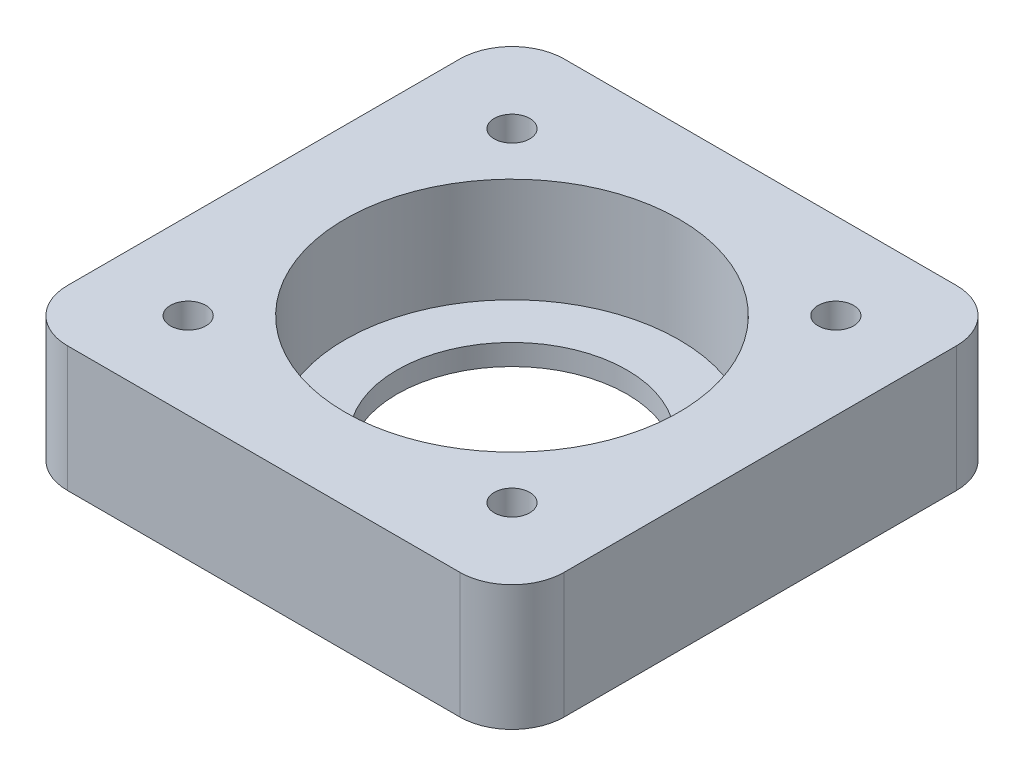
ISO-10303-21;
HEADER;
FILE_DESCRIPTION(('STEP AP214'),'2;1');
FILE_NAME('part.step','',(''),(''),'','','');
FILE_SCHEMA(('AUTOMOTIVE_DESIGN { 1 0 10303 214 1 1 1 1 }'));
ENDSEC;
DATA;
#1=APPLICATION_CONTEXT('core data for automotive mechanical design processes');
#2=APPLICATION_PROTOCOL_DEFINITION('international standard','automotive_design',2000,#1);
#3=PRODUCT_CONTEXT('',#1,'mechanical');
#4=PRODUCT('Part','Part','',(#3));
#5=PRODUCT_RELATED_PRODUCT_CATEGORY('part','',(#4));
#6=PRODUCT_DEFINITION_FORMATION('','',#4);
#7=PRODUCT_DEFINITION_CONTEXT('part definition',#1,'design');
#8=PRODUCT_DEFINITION('design','',#6,#7);
#9=PRODUCT_DEFINITION_SHAPE('','',#8);
#10=(LENGTH_UNIT() NAMED_UNIT(*) SI_UNIT(.MILLI.,.METRE.));
#11=(NAMED_UNIT(*) PLANE_ANGLE_UNIT() SI_UNIT($,.RADIAN.));
#12=(NAMED_UNIT(*) SI_UNIT($,.STERADIAN.) SOLID_ANGLE_UNIT());
#13=UNCERTAINTY_MEASURE_WITH_UNIT(LENGTH_MEASURE(1.E-05),#10,'distance_accuracy_value','');
#14=(GEOMETRIC_REPRESENTATION_CONTEXT(3) GLOBAL_UNCERTAINTY_ASSIGNED_CONTEXT((#13)) GLOBAL_UNIT_ASSIGNED_CONTEXT((#10,
#11,#12)) REPRESENTATION_CONTEXT('',''));
#15=CARTESIAN_POINT('',(0.,0.,0.));
#16=DIRECTION('',(0.,0.,1.));
#17=DIRECTION('',(1.,0.,0.));
#18=AXIS2_PLACEMENT_3D('',#15,#16,#17);
#19=CARTESIAN_POINT('',(1.11022302462516E-13,12.,-2.22044604925031E-13));
#20=DIRECTION('',(0.,-1.,0.));
#21=DIRECTION('',(0.,0.,-1.));
#22=AXIS2_PLACEMENT_3D('',#19,#20,#21);
#23=CYLINDRICAL_SURFACE('',#22,16.);
#24=CARTESIAN_POINT('',(1.11022302462516E-13,12.,-2.22044604925031E-13));
#25=DIRECTION('',(0.,1.,0.));
#26=DIRECTION('',(0.,0.,1.));
#27=AXIS2_PLACEMENT_3D('',#24,#25,#26);
#28=CIRCLE('',#27,16.);
#29=CARTESIAN_POINT('',(1.11022302462516E-13,12.,15.9999999999998));
#30=VERTEX_POINT('',#29);
#31=EDGE_CURVE('E221',#30,#30,#28,.T.);
#32=ORIENTED_EDGE('',*,*,#31,.T.);
#33=EDGE_LOOP('',(#32));
#34=FACE_BOUND('',#33,.T.);
#35=CARTESIAN_POINT('',(1.11022302462516E-13,2.,-2.22044604925031E-13));
#36=DIRECTION('',(0.,-1.,0.));
#37=DIRECTION('',(0.,0.,-1.));
#38=AXIS2_PLACEMENT_3D('',#35,#36,#37);
#39=CIRCLE('',#38,16.);
#40=CARTESIAN_POINT('',(1.11022302462516E-13,2.,-16.0000000000002));
#41=VERTEX_POINT('',#40);
#42=EDGE_CURVE('E201',#41,#41,#39,.F.);
#43=ORIENTED_EDGE('',*,*,#42,.F.);
#44=EDGE_LOOP('',(#43));
#45=FACE_BOUND('',#44,.T.);
#46=ADVANCED_FACE('F47',(#34,#45),#23,.F.);
#47=CARTESIAN_POINT('',(23.775,12.,0.));
#48=DIRECTION('',(1.,0.,0.));
#49=DIRECTION('',(0.,0.,-1.));
#50=AXIS2_PLACEMENT_3D('',#47,#48,#49);
#51=PLANE('',#50);
#52=DIRECTION('',(0.,0.,1.));
#53=VECTOR('',#52,1.);
#54=CARTESIAN_POINT('',(23.775,0.,0.));
#55=LINE('',#54,#53);
#56=CARTESIAN_POINT('',(23.775,0.,-18.775));
#57=VERTEX_POINT('',#56);
#58=CARTESIAN_POINT('',(23.775,0.,18.775));
#59=VERTEX_POINT('',#58);
#60=EDGE_CURVE('E137',#57,#59,#55,.T.);
#61=ORIENTED_EDGE('',*,*,#60,.F.);
#62=DIRECTION('',(0.,-1.,0.));
#63=VECTOR('',#62,1.);
#64=CARTESIAN_POINT('',(23.775,12.,-18.775));
#65=LINE('',#64,#63);
#66=CARTESIAN_POINT('',(23.775,12.,-18.775));
#67=VERTEX_POINT('',#66);
#68=EDGE_CURVE('E165',#57,#67,#65,.F.);
#69=ORIENTED_EDGE('',*,*,#68,.T.);
#70=DIRECTION('',(0.,0.,1.));
#71=VECTOR('',#70,1.);
#72=CARTESIAN_POINT('',(23.775,12.,0.));
#73=LINE('',#72,#71);
#74=CARTESIAN_POINT('',(23.775,12.,18.775));
#75=VERTEX_POINT('',#74);
#76=EDGE_CURVE('E192',#67,#75,#73,.T.);
#77=ORIENTED_EDGE('',*,*,#76,.T.);
#78=DIRECTION('',(0.,-1.,0.));
#79=VECTOR('',#78,1.);
#80=CARTESIAN_POINT('',(23.775,0.,18.775));
#81=LINE('',#80,#79);
#82=EDGE_CURVE('E161',#75,#59,#81,.T.);
#83=ORIENTED_EDGE('',*,*,#82,.T.);
#84=EDGE_LOOP('',(#61,#69,#77,#83));
#85=FACE_BOUND('',#84,.T.);
#86=ADVANCED_FACE('F249',(#85),#51,.T.);
#87=CARTESIAN_POINT('',(0.,12.,-23.775));
#88=DIRECTION('',(0.,0.,-1.));
#89=DIRECTION('',(-1.,0.,0.));
#90=AXIS2_PLACEMENT_3D('',#87,#88,#89);
#91=PLANE('',#90);
#92=DIRECTION('',(1.,0.,0.));
#93=VECTOR('',#92,1.);
#94=CARTESIAN_POINT('',(0.,12.,-23.775));
#95=LINE('',#94,#93);
#96=CARTESIAN_POINT('',(-18.775,12.,-23.775));
#97=VERTEX_POINT('',#96);
#98=CARTESIAN_POINT('',(18.775,12.,-23.775));
#99=VERTEX_POINT('',#98);
#100=EDGE_CURVE('E189',#97,#99,#95,.T.);
#101=ORIENTED_EDGE('',*,*,#100,.T.);
#102=DIRECTION('',(0.,-1.,0.));
#103=VECTOR('',#102,1.);
#104=CARTESIAN_POINT('',(18.775,12.,-23.775));
#105=LINE('',#104,#103);
#106=CARTESIAN_POINT('',(18.775,0.,-23.775));
#107=VERTEX_POINT('',#106);
#108=EDGE_CURVE('E127',#99,#107,#105,.T.);
#109=ORIENTED_EDGE('',*,*,#108,.T.);
#110=DIRECTION('',(1.,0.,0.));
#111=VECTOR('',#110,1.);
#112=CARTESIAN_POINT('',(0.,0.,-23.775));
#113=LINE('',#112,#111);
#114=CARTESIAN_POINT('',(-18.775,0.,-23.775));
#115=VERTEX_POINT('',#114);
#116=EDGE_CURVE('E118',#115,#107,#113,.T.);
#117=ORIENTED_EDGE('',*,*,#116,.F.);
#118=DIRECTION('',(0.,-1.,0.));
#119=VECTOR('',#118,1.);
#120=CARTESIAN_POINT('',(-18.775,12.,-23.775));
#121=LINE('',#120,#119);
#122=EDGE_CURVE('E133',#115,#97,#121,.F.);
#123=ORIENTED_EDGE('',*,*,#122,.T.);
#124=EDGE_LOOP('',(#101,#109,#117,#123));
#125=FACE_BOUND('',#124,.T.);
#126=ADVANCED_FACE('F132',(#125),#91,.T.);
#127=CARTESIAN_POINT('',(-23.775,12.,0.));
#128=DIRECTION('',(1.,0.,0.));
#129=DIRECTION('',(0.,0.,-1.));
#130=AXIS2_PLACEMENT_3D('',#127,#128,#129);
#131=PLANE('',#130);
#132=DIRECTION('',(0.,0.,1.));
#133=VECTOR('',#132,1.);
#134=CARTESIAN_POINT('',(-23.775,0.,0.));
#135=LINE('',#134,#133);
#136=CARTESIAN_POINT('',(-23.775,0.,-18.775));
#137=VERTEX_POINT('',#136);
#138=CARTESIAN_POINT('',(-23.775,0.,18.775));
#139=VERTEX_POINT('',#138);
#140=EDGE_CURVE('E120',#137,#139,#135,.T.);
#141=ORIENTED_EDGE('',*,*,#140,.T.);
#142=DIRECTION('',(0.,-1.,0.));
#143=VECTOR('',#142,1.);
#144=CARTESIAN_POINT('',(-23.775,12.,18.775));
#145=LINE('',#144,#143);
#146=CARTESIAN_POINT('',(-23.775,12.,18.775));
#147=VERTEX_POINT('',#146);
#148=EDGE_CURVE('E11',#139,#147,#145,.F.);
#149=ORIENTED_EDGE('',*,*,#148,.T.);
#150=DIRECTION('',(0.,0.,1.));
#151=VECTOR('',#150,1.);
#152=CARTESIAN_POINT('',(-23.775,12.,0.));
#153=LINE('',#152,#151);
#154=CARTESIAN_POINT('',(-23.775,12.,-18.775));
#155=VERTEX_POINT('',#154);
#156=EDGE_CURVE('E147',#155,#147,#153,.T.);
#157=ORIENTED_EDGE('',*,*,#156,.F.);
#158=DIRECTION('',(0.,-1.,0.));
#159=VECTOR('',#158,1.);
#160=CARTESIAN_POINT('',(-23.775,0.,-18.775));
#161=LINE('',#160,#159);
#162=EDGE_CURVE('E56',#155,#137,#161,.T.);
#163=ORIENTED_EDGE('',*,*,#162,.T.);
#164=EDGE_LOOP('',(#141,#149,#157,#163));
#165=FACE_BOUND('',#164,.T.);
#166=ADVANCED_FACE('F186',(#165),#131,.F.);
#167=CARTESIAN_POINT('',(-15.5,12.,-15.4999999999998));
#168=DIRECTION('',(0.,-1.,0.));
#169=DIRECTION('',(0.,0.,-1.));
#170=AXIS2_PLACEMENT_3D('',#167,#168,#169);
#171=CYLINDRICAL_SURFACE('',#170,1.7);
#172=CARTESIAN_POINT('',(-15.5,12.,-15.4999999999998));
#173=DIRECTION('',(0.,1.,0.));
#174=DIRECTION('',(0.,0.,1.));
#175=AXIS2_PLACEMENT_3D('',#172,#173,#174);
#176=CIRCLE('',#175,1.7);
#177=CARTESIAN_POINT('',(-15.5,12.,-13.7999999999998));
#178=VERTEX_POINT('',#177);
#179=EDGE_CURVE('E240',#178,#178,#176,.T.);
#180=ORIENTED_EDGE('',*,*,#179,.T.);
#181=EDGE_LOOP('',(#180));
#182=FACE_BOUND('',#181,.T.);
#183=CARTESIAN_POINT('',(-15.5,0.,-15.4999999999998));
#184=DIRECTION('',(0.,1.,0.));
#185=DIRECTION('',(0.,0.,1.));
#186=AXIS2_PLACEMENT_3D('',#183,#184,#185);
#187=CIRCLE('',#186,1.7);
#188=CARTESIAN_POINT('',(-15.5,0.,-13.7999999999998));
#189=VERTEX_POINT('',#188);
#190=EDGE_CURVE('E209',#189,#189,#187,.T.);
#191=ORIENTED_EDGE('',*,*,#190,.F.);
#192=EDGE_LOOP('',(#191));
#193=FACE_BOUND('',#192,.T.);
#194=ADVANCED_FACE('F376',(#182,#193),#171,.F.);
#195=CARTESIAN_POINT('',(15.5,12.,-15.4999999999998));
#196=DIRECTION('',(0.,-1.,0.));
#197=DIRECTION('',(0.,0.,-1.));
#198=AXIS2_PLACEMENT_3D('',#195,#196,#197);
#199=CYLINDRICAL_SURFACE('',#198,1.7);
#200=CARTESIAN_POINT('',(15.5,12.,-15.4999999999998));
#201=DIRECTION('',(0.,1.,0.));
#202=DIRECTION('',(0.,0.,1.));
#203=AXIS2_PLACEMENT_3D('',#200,#201,#202);
#204=CIRCLE('',#203,1.7);
#205=CARTESIAN_POINT('',(15.5,12.,-13.7999999999998));
#206=VERTEX_POINT('',#205);
#207=EDGE_CURVE('E236',#206,#206,#204,.T.);
#208=ORIENTED_EDGE('',*,*,#207,.T.);
#209=EDGE_LOOP('',(#208));
#210=FACE_BOUND('',#209,.T.);
#211=CARTESIAN_POINT('',(15.5,0.,-15.4999999999998));
#212=DIRECTION('',(0.,1.,0.));
#213=DIRECTION('',(0.,0.,1.));
#214=AXIS2_PLACEMENT_3D('',#211,#212,#213);
#215=CIRCLE('',#214,1.7);
#216=CARTESIAN_POINT('',(15.5,0.,-13.7999999999998));
#217=VERTEX_POINT('',#216);
#218=EDGE_CURVE('E205',#217,#217,#215,.T.);
#219=ORIENTED_EDGE('',*,*,#218,.F.);
#220=EDGE_LOOP('',(#219));
#221=FACE_BOUND('',#220,.T.);
#222=ADVANCED_FACE('F367',(#210,#221),#199,.F.);
#223=CARTESIAN_POINT('',(-15.5,12.,15.5000000000002));
#224=DIRECTION('',(0.,-1.,0.));
#225=DIRECTION('',(0.,0.,-1.));
#226=AXIS2_PLACEMENT_3D('',#223,#224,#225);
#227=CYLINDRICAL_SURFACE('',#226,1.7);
#228=CARTESIAN_POINT('',(-15.5,12.,15.5000000000002));
#229=DIRECTION('',(0.,1.,0.));
#230=DIRECTION('',(0.,0.,1.));
#231=AXIS2_PLACEMENT_3D('',#228,#229,#230);
#232=CIRCLE('',#231,1.7);
#233=CARTESIAN_POINT('',(-15.5,12.,17.2000000000002));
#234=VERTEX_POINT('',#233);
#235=EDGE_CURVE('E227',#234,#234,#232,.T.);
#236=ORIENTED_EDGE('',*,*,#235,.T.);
#237=EDGE_LOOP('',(#236));
#238=FACE_BOUND('',#237,.T.);
#239=CARTESIAN_POINT('',(-15.5,0.,15.5000000000002));
#240=DIRECTION('',(0.,1.,0.));
#241=DIRECTION('',(0.,0.,1.));
#242=AXIS2_PLACEMENT_3D('',#239,#240,#241);
#243=CIRCLE('',#242,1.7);
#244=CARTESIAN_POINT('',(-15.5,0.,17.2000000000002));
#245=VERTEX_POINT('',#244);
#246=EDGE_CURVE('E200',#245,#245,#243,.T.);
#247=ORIENTED_EDGE('',*,*,#246,.F.);
#248=EDGE_LOOP('',(#247));
#249=FACE_BOUND('',#248,.T.);
#250=ADVANCED_FACE('F283',(#238,#249),#227,.F.);
#251=CARTESIAN_POINT('',(15.5,12.,15.5000000000002));
#252=DIRECTION('',(0.,-1.,0.));
#253=DIRECTION('',(0.,0.,-1.));
#254=AXIS2_PLACEMENT_3D('',#251,#252,#253);
#255=CYLINDRICAL_SURFACE('',#254,1.7);
#256=CARTESIAN_POINT('',(15.5,12.,15.5000000000002));
#257=DIRECTION('',(0.,1.,0.));
#258=DIRECTION('',(0.,0.,1.));
#259=AXIS2_PLACEMENT_3D('',#256,#257,#258);
#260=CIRCLE('',#259,1.7);
#261=CARTESIAN_POINT('',(15.5,12.,17.2000000000002));
#262=VERTEX_POINT('',#261);
#263=EDGE_CURVE('E217',#262,#262,#260,.T.);
#264=ORIENTED_EDGE('',*,*,#263,.T.);
#265=EDGE_LOOP('',(#264));
#266=FACE_BOUND('',#265,.T.);
#267=CARTESIAN_POINT('',(15.5,0.,15.5000000000002));
#268=DIRECTION('',(0.,1.,0.));
#269=DIRECTION('',(0.,0.,1.));
#270=AXIS2_PLACEMENT_3D('',#267,#268,#269);
#271=CIRCLE('',#270,1.7);
#272=CARTESIAN_POINT('',(15.5,0.,17.2000000000002));
#273=VERTEX_POINT('',#272);
#274=EDGE_CURVE('E196',#273,#273,#271,.T.);
#275=ORIENTED_EDGE('',*,*,#274,.F.);
#276=EDGE_LOOP('',(#275));
#277=FACE_BOUND('',#276,.T.);
#278=ADVANCED_FACE('F269',(#266,#277),#255,.F.);
#279=CARTESIAN_POINT('',(0.,12.,23.775));
#280=DIRECTION('',(0.,0.,-1.));
#281=DIRECTION('',(-1.,0.,0.));
#282=AXIS2_PLACEMENT_3D('',#279,#280,#281);
#283=PLANE('',#282);
#284=DIRECTION('',(1.,0.,0.));
#285=VECTOR('',#284,1.);
#286=CARTESIAN_POINT('',(0.,0.,23.775));
#287=LINE('',#286,#285);
#288=CARTESIAN_POINT('',(-18.775,0.,23.775));
#289=VERTEX_POINT('',#288);
#290=CARTESIAN_POINT('',(18.775,0.,23.775));
#291=VERTEX_POINT('',#290);
#292=EDGE_CURVE('E150',#289,#291,#287,.T.);
#293=ORIENTED_EDGE('',*,*,#292,.T.);
#294=DIRECTION('',(0.,-1.,0.));
#295=VECTOR('',#294,1.);
#296=CARTESIAN_POINT('',(18.775,12.,23.775));
#297=LINE('',#296,#295);
#298=CARTESIAN_POINT('',(18.775,12.,23.775));
#299=VERTEX_POINT('',#298);
#300=EDGE_CURVE('E63',#291,#299,#297,.F.);
#301=ORIENTED_EDGE('',*,*,#300,.T.);
#302=DIRECTION('',(1.,0.,0.));
#303=VECTOR('',#302,1.);
#304=CARTESIAN_POINT('',(0.,12.,23.775));
#305=LINE('',#304,#303);
#306=CARTESIAN_POINT('',(-18.775,12.,23.775));
#307=VERTEX_POINT('',#306);
#308=EDGE_CURVE('E142',#307,#299,#305,.T.);
#309=ORIENTED_EDGE('',*,*,#308,.F.);
#310=DIRECTION('',(0.,-1.,0.));
#311=VECTOR('',#310,1.);
#312=CARTESIAN_POINT('',(-18.775,12.,23.775));
#313=LINE('',#312,#311);
#314=EDGE_CURVE('E178',#307,#289,#313,.T.);
#315=ORIENTED_EDGE('',*,*,#314,.T.);
#316=EDGE_LOOP('',(#293,#301,#309,#315));
#317=FACE_BOUND('',#316,.T.);
#318=ADVANCED_FACE('F259',(#317),#283,.F.);
#319=CARTESIAN_POINT('',(0.,12.,0.));
#320=DIRECTION('',(0.,1.,0.));
#321=DIRECTION('',(0.,0.,1.));
#322=AXIS2_PLACEMENT_3D('',#319,#320,#321);
#323=PLANE('',#322);
#324=ORIENTED_EDGE('',*,*,#263,.F.);
#325=EDGE_LOOP('',(#324));
#326=FACE_BOUND('',#325,.T.);
#327=ORIENTED_EDGE('',*,*,#31,.F.);
#328=EDGE_LOOP('',(#327));
#329=FACE_BOUND('',#328,.T.);
#330=ORIENTED_EDGE('',*,*,#235,.F.);
#331=EDGE_LOOP('',(#330));
#332=FACE_BOUND('',#331,.T.);
#333=ORIENTED_EDGE('',*,*,#207,.F.);
#334=EDGE_LOOP('',(#333));
#335=FACE_BOUND('',#334,.T.);
#336=ORIENTED_EDGE('',*,*,#179,.F.);
#337=EDGE_LOOP('',(#336));
#338=FACE_BOUND('',#337,.T.);
#339=ORIENTED_EDGE('',*,*,#76,.F.);
#340=CARTESIAN_POINT('',(18.775,12.,-18.775));
#341=DIRECTION('',(0.,1.,0.));
#342=DIRECTION('',(0.,0.,1.));
#343=AXIS2_PLACEMENT_3D('',#340,#341,#342);
#344=CIRCLE('',#343,5.);
#345=EDGE_CURVE('E175',#67,#99,#344,.T.);
#346=ORIENTED_EDGE('',*,*,#345,.T.);
#347=ORIENTED_EDGE('',*,*,#100,.F.);
#348=CARTESIAN_POINT('',(-18.775,12.,-18.775));
#349=DIRECTION('',(0.,1.,0.));
#350=DIRECTION('',(0.,0.,1.));
#351=AXIS2_PLACEMENT_3D('',#348,#349,#350);
#352=CIRCLE('',#351,5.);
#353=EDGE_CURVE('E140',#97,#155,#352,.T.);
#354=ORIENTED_EDGE('',*,*,#353,.T.);
#355=ORIENTED_EDGE('',*,*,#156,.T.);
#356=CARTESIAN_POINT('',(-18.775,12.,18.775));
#357=DIRECTION('',(0.,1.,0.));
#358=DIRECTION('',(0.,0.,1.));
#359=AXIS2_PLACEMENT_3D('',#356,#357,#358);
#360=CIRCLE('',#359,5.);
#361=EDGE_CURVE('E70',#147,#307,#360,.T.);
#362=ORIENTED_EDGE('',*,*,#361,.T.);
#363=ORIENTED_EDGE('',*,*,#308,.T.);
#364=CARTESIAN_POINT('',(18.775,12.,18.775));
#365=DIRECTION('',(0.,1.,0.));
#366=DIRECTION('',(0.,0.,1.));
#367=AXIS2_PLACEMENT_3D('',#364,#365,#366);
#368=CIRCLE('',#367,5.);
#369=EDGE_CURVE('E172',#299,#75,#368,.T.);
#370=ORIENTED_EDGE('',*,*,#369,.T.);
#371=EDGE_LOOP('',(#339,#346,#347,#354,#355,#362,#363,#370));
#372=FACE_BOUND('',#371,.T.);
#373=ADVANCED_FACE('F257',(#326,#329,#332,#335,#338,#372),#323,.T.);
#374=CARTESIAN_POINT('',(0.,0.,0.));
#375=DIRECTION('',(0.,1.,0.));
#376=DIRECTION('',(0.,0.,1.));
#377=AXIS2_PLACEMENT_3D('',#374,#375,#376);
#378=PLANE('',#377);
#379=ORIENTED_EDGE('',*,*,#274,.T.);
#380=EDGE_LOOP('',(#379));
#381=FACE_BOUND('',#380,.T.);
#382=ORIENTED_EDGE('',*,*,#246,.T.);
#383=EDGE_LOOP('',(#382));
#384=FACE_BOUND('',#383,.T.);
#385=ORIENTED_EDGE('',*,*,#218,.T.);
#386=EDGE_LOOP('',(#385));
#387=FACE_BOUND('',#386,.T.);
#388=ORIENTED_EDGE('',*,*,#190,.T.);
#389=EDGE_LOOP('',(#388));
#390=FACE_BOUND('',#389,.T.);
#391=ORIENTED_EDGE('',*,*,#116,.T.);
#392=CARTESIAN_POINT('',(18.775,0.,-18.775));
#393=DIRECTION('',(0.,1.,0.));
#394=DIRECTION('',(0.,0.,1.));
#395=AXIS2_PLACEMENT_3D('',#392,#393,#394);
#396=CIRCLE('',#395,5.);
#397=EDGE_CURVE('E158',#107,#57,#396,.F.);
#398=ORIENTED_EDGE('',*,*,#397,.T.);
#399=ORIENTED_EDGE('',*,*,#60,.T.);
#400=CARTESIAN_POINT('',(18.775,0.,18.775));
#401=DIRECTION('',(0.,1.,0.));
#402=DIRECTION('',(0.,0.,1.));
#403=AXIS2_PLACEMENT_3D('',#400,#401,#402);
#404=CIRCLE('',#403,5.);
#405=EDGE_CURVE('E155',#59,#291,#404,.F.);
#406=ORIENTED_EDGE('',*,*,#405,.T.);
#407=ORIENTED_EDGE('',*,*,#292,.F.);
#408=CARTESIAN_POINT('',(-18.775,0.,18.775));
#409=DIRECTION('',(0.,1.,0.));
#410=DIRECTION('',(0.,0.,1.));
#411=AXIS2_PLACEMENT_3D('',#408,#409,#410);
#412=CIRCLE('',#411,5.);
#413=EDGE_CURVE('E126',#289,#139,#412,.F.);
#414=ORIENTED_EDGE('',*,*,#413,.T.);
#415=ORIENTED_EDGE('',*,*,#140,.F.);
#416=CARTESIAN_POINT('',(-18.775,0.,-18.775));
#417=DIRECTION('',(0.,1.,0.));
#418=DIRECTION('',(0.,0.,1.));
#419=AXIS2_PLACEMENT_3D('',#416,#417,#418);
#420=CIRCLE('',#419,5.);
#421=EDGE_CURVE('E114',#137,#115,#420,.F.);
#422=ORIENTED_EDGE('',*,*,#421,.T.);
#423=EDGE_LOOP('',(#391,#398,#399,#406,#407,#414,#415,#422));
#424=FACE_BOUND('',#423,.T.);
#425=CARTESIAN_POINT('',(0.,0.,0.));
#426=DIRECTION('',(0.,-1.,0.));
#427=DIRECTION('',(0.,0.,-1.));
#428=AXIS2_PLACEMENT_3D('',#425,#426,#427);
#429=CIRCLE('',#428,11.0000000000001);
#430=CARTESIAN_POINT('',(0.,0.,-11.0000000000001));
#431=VERTEX_POINT('',#430);
#432=EDGE_CURVE('E230',#431,#431,#429,.T.);
#433=ORIENTED_EDGE('',*,*,#432,.F.);
#434=EDGE_LOOP('',(#433));
#435=FACE_BOUND('',#434,.T.);
#436=ADVANCED_FACE('F116',(#381,#384,#387,#390,#424,#435),#378,.F.);
#437=CARTESIAN_POINT('',(0.,2.,0.));
#438=DIRECTION('',(0.,-1.,0.));
#439=DIRECTION('',(0.,0.,-1.));
#440=AXIS2_PLACEMENT_3D('',#437,#438,#439);
#441=CYLINDRICAL_SURFACE('',#440,11.0000000000001);
#442=CARTESIAN_POINT('',(0.,2.,0.));
#443=DIRECTION('',(0.,-1.,0.));
#444=DIRECTION('',(0.,0.,-1.));
#445=AXIS2_PLACEMENT_3D('',#442,#443,#444);
#446=CIRCLE('',#445,11.0000000000001);
#447=CARTESIAN_POINT('',(0.,2.,-11.0000000000001));
#448=VERTEX_POINT('',#447);
#449=EDGE_CURVE('E531',#448,#448,#446,.T.);
#450=ORIENTED_EDGE('',*,*,#449,.F.);
#451=EDGE_LOOP('',(#450));
#452=FACE_BOUND('',#451,.T.);
#453=ORIENTED_EDGE('',*,*,#432,.T.);
#454=EDGE_LOOP('',(#453));
#455=FACE_BOUND('',#454,.T.);
#456=ADVANCED_FACE('F266',(#452,#455),#441,.F.);
#457=CARTESIAN_POINT('',(0.,2.,0.));
#458=DIRECTION('',(0.,-1.,0.));
#459=DIRECTION('',(0.,0.,-1.));
#460=AXIS2_PLACEMENT_3D('',#457,#458,#459);
#461=PLANE('',#460);
#462=ORIENTED_EDGE('',*,*,#449,.T.);
#463=EDGE_LOOP('',(#462));
#464=FACE_BOUND('',#463,.T.);
#465=ORIENTED_EDGE('',*,*,#42,.T.);
#466=EDGE_LOOP('',(#465));
#467=FACE_BOUND('',#466,.T.);
#468=ADVANCED_FACE('F289',(#464,#467),#461,.F.);
#469=CARTESIAN_POINT('',(18.775,12.,-18.775));
#470=DIRECTION('',(0.,-1.,0.));
#471=DIRECTION('',(0.,0.,-1.));
#472=AXIS2_PLACEMENT_3D('',#469,#470,#471);
#473=CYLINDRICAL_SURFACE('',#472,5.);
#474=ORIENTED_EDGE('',*,*,#345,.F.);
#475=ORIENTED_EDGE('',*,*,#68,.F.);
#476=ORIENTED_EDGE('',*,*,#397,.F.);
#477=ORIENTED_EDGE('',*,*,#108,.F.);
#478=EDGE_LOOP('',(#474,#475,#476,#477));
#479=FACE_BOUND('',#478,.T.);
#480=ADVANCED_FACE('F256',(#479),#473,.T.);
#481=CARTESIAN_POINT('',(18.775,12.,18.775));
#482=DIRECTION('',(0.,1.,0.));
#483=DIRECTION('',(0.,0.,1.));
#484=AXIS2_PLACEMENT_3D('',#481,#482,#483);
#485=CYLINDRICAL_SURFACE('',#484,5.);
#486=ORIENTED_EDGE('',*,*,#369,.F.);
#487=ORIENTED_EDGE('',*,*,#300,.F.);
#488=ORIENTED_EDGE('',*,*,#405,.F.);
#489=ORIENTED_EDGE('',*,*,#82,.F.);
#490=EDGE_LOOP('',(#486,#487,#488,#489));
#491=FACE_BOUND('',#490,.T.);
#492=ADVANCED_FACE('F254',(#491),#485,.T.);
#493=CARTESIAN_POINT('',(-18.775,12.,18.775));
#494=DIRECTION('',(0.,-1.,0.));
#495=DIRECTION('',(0.,0.,-1.));
#496=AXIS2_PLACEMENT_3D('',#493,#494,#495);
#497=CYLINDRICAL_SURFACE('',#496,5.);
#498=ORIENTED_EDGE('',*,*,#361,.F.);
#499=ORIENTED_EDGE('',*,*,#148,.F.);
#500=ORIENTED_EDGE('',*,*,#413,.F.);
#501=ORIENTED_EDGE('',*,*,#314,.F.);
#502=EDGE_LOOP('',(#498,#499,#500,#501));
#503=FACE_BOUND('',#502,.T.);
#504=ADVANCED_FACE('F291',(#503),#497,.T.);
#505=CARTESIAN_POINT('',(-18.775,12.,-18.775));
#506=DIRECTION('',(0.,1.,0.));
#507=DIRECTION('',(0.,0.,1.));
#508=AXIS2_PLACEMENT_3D('',#505,#506,#507);
#509=CYLINDRICAL_SURFACE('',#508,5.);
#510=ORIENTED_EDGE('',*,*,#353,.F.);
#511=ORIENTED_EDGE('',*,*,#122,.F.);
#512=ORIENTED_EDGE('',*,*,#421,.F.);
#513=ORIENTED_EDGE('',*,*,#162,.F.);
#514=EDGE_LOOP('',(#510,#511,#512,#513));
#515=FACE_BOUND('',#514,.T.);
#516=ADVANCED_FACE('F49',(#515),#509,.T.);
#517=CLOSED_SHELL('',(#46,#86,#126,#166,#194,#222,#250,#278,#318,#373,#436,#456,#468,#480,#492,
#504,#516));
#518=MANIFOLD_SOLID_BREP('B2',#517);
#519=ADVANCED_BREP_SHAPE_REPRESENTATION('',(#18,#518),#14);
#520=SHAPE_DEFINITION_REPRESENTATION(#9,#519);
ENDSEC;
END-ISO-10303-21;
